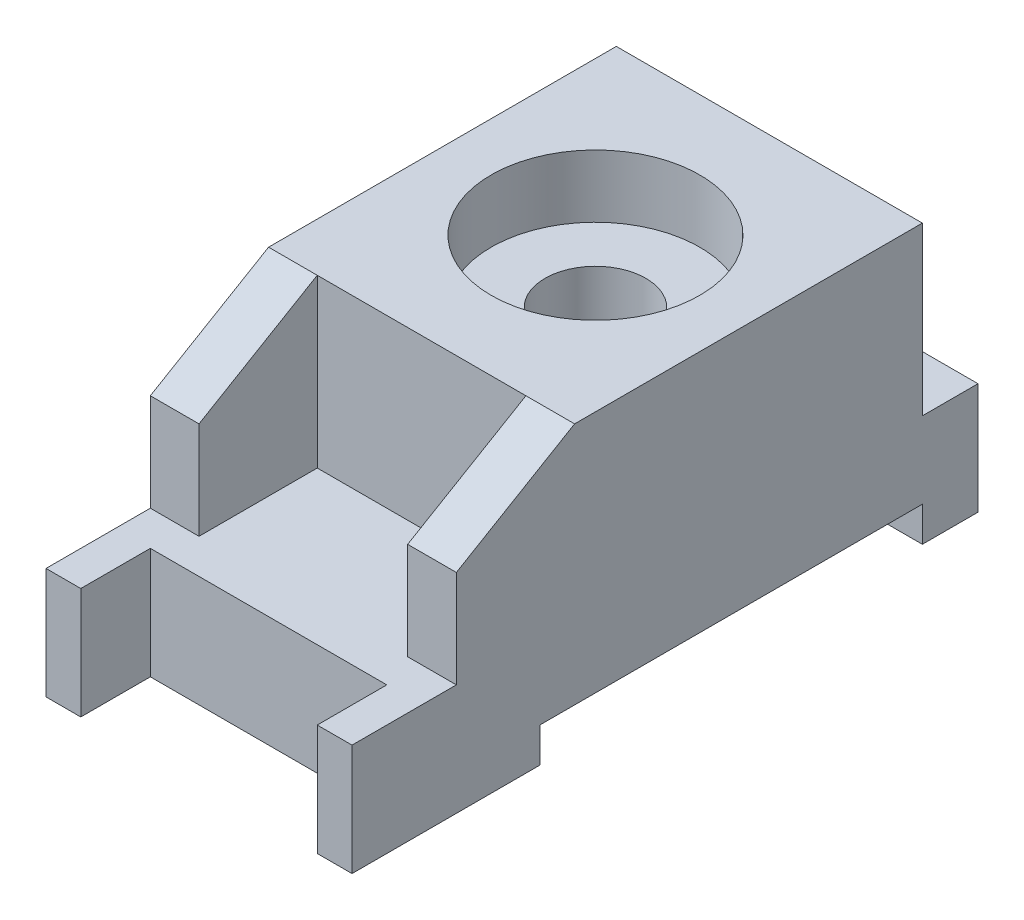
ISO-10303-21;
HEADER;
FILE_DESCRIPTION(('STEP AP214'),'2;1');
FILE_NAME('part.step','',(''),(''),'','','');
FILE_SCHEMA(('AUTOMOTIVE_DESIGN { 1 0 10303 214 1 1 1 1 }'));
ENDSEC;
DATA;
#1=APPLICATION_CONTEXT('core data for automotive mechanical design processes');
#2=APPLICATION_PROTOCOL_DEFINITION('international standard','automotive_design',2000,#1);
#3=PRODUCT_CONTEXT('',#1,'mechanical');
#4=PRODUCT('Part','Part','',(#3));
#5=PRODUCT_RELATED_PRODUCT_CATEGORY('part','',(#4));
#6=PRODUCT_DEFINITION_FORMATION('','',#4);
#7=PRODUCT_DEFINITION_CONTEXT('part definition',#1,'design');
#8=PRODUCT_DEFINITION('design','',#6,#7);
#9=PRODUCT_DEFINITION_SHAPE('','',#8);
#10=(LENGTH_UNIT() NAMED_UNIT(*) SI_UNIT(.MILLI.,.METRE.));
#11=(NAMED_UNIT(*) PLANE_ANGLE_UNIT() SI_UNIT($,.RADIAN.));
#12=(NAMED_UNIT(*) SI_UNIT($,.STERADIAN.) SOLID_ANGLE_UNIT());
#13=UNCERTAINTY_MEASURE_WITH_UNIT(LENGTH_MEASURE(1.E-05),#10,'distance_accuracy_value','');
#14=(GEOMETRIC_REPRESENTATION_CONTEXT(3) GLOBAL_UNCERTAINTY_ASSIGNED_CONTEXT((#13)) GLOBAL_UNIT_ASSIGNED_CONTEXT((#10,
#11,#12)) REPRESENTATION_CONTEXT('',''));
#15=CARTESIAN_POINT('',(0.,0.,0.));
#16=DIRECTION('',(0.,0.,1.));
#17=DIRECTION('',(1.,0.,0.));
#18=AXIS2_PLACEMENT_3D('',#15,#16,#17);
#19=CARTESIAN_POINT('',(-22.,32.,75.));
#20=DIRECTION('',(0.,0.,-1.));
#21=DIRECTION('',(-1.,0.,0.));
#22=AXIS2_PLACEMENT_3D('',#19,#20,#21);
#23=PLANE('',#22);
#24=DIRECTION('',(0.,1.,0.));
#25=VECTOR('',#24,1.);
#26=CARTESIAN_POINT('',(-15.,8.,75.));
#27=LINE('',#26,#25);
#28=CARTESIAN_POINT('',(-15.,8.,75.));
#29=VERTEX_POINT('',#28);
#30=CARTESIAN_POINT('',(-15.,22.,75.));
#31=VERTEX_POINT('',#30);
#32=EDGE_CURVE('E241',#29,#31,#27,.T.);
#33=ORIENTED_EDGE('',*,*,#32,.T.);
#34=DIRECTION('',(1.,0.,0.));
#35=VECTOR('',#34,1.);
#36=CARTESIAN_POINT('',(-22.,22.,75.));
#37=LINE('',#36,#35);
#38=CARTESIAN_POINT('',(-22.,22.,75.));
#39=VERTEX_POINT('',#38);
#40=EDGE_CURVE('E65',#39,#31,#37,.T.);
#41=ORIENTED_EDGE('',*,*,#40,.F.);
#42=DIRECTION('',(0.,-1.,0.));
#43=VECTOR('',#42,1.);
#44=CARTESIAN_POINT('',(-22.,32.,75.));
#45=LINE('',#44,#43);
#46=CARTESIAN_POINT('',(-22.,8.,75.));
#47=VERTEX_POINT('',#46);
#48=EDGE_CURVE('E239',#39,#47,#45,.T.);
#49=ORIENTED_EDGE('',*,*,#48,.T.);
#50=DIRECTION('',(1.,0.,0.));
#51=VECTOR('',#50,1.);
#52=CARTESIAN_POINT('',(-22.,8.,75.));
#53=LINE('',#52,#51);
#54=EDGE_CURVE('E295',#47,#29,#53,.T.);
#55=ORIENTED_EDGE('',*,*,#54,.T.);
#56=EDGE_LOOP('',(#33,#41,#49,#55));
#57=FACE_BOUND('',#56,.T.);
#58=ADVANCED_FACE('F48',(#57),#23,.F.);
#59=CARTESIAN_POINT('',(-22.,8.,90.));
#60=DIRECTION('',(0.,-1.,0.));
#61=DIRECTION('',(0.,0.,-1.));
#62=AXIS2_PLACEMENT_3D('',#59,#60,#61);
#63=PLANE('',#62);
#64=DIRECTION('',(-1.,0.,0.));
#65=VECTOR('',#64,1.);
#66=CARTESIAN_POINT('',(22.,8.,8.));
#67=LINE('',#66,#65);
#68=CARTESIAN_POINT('',(22.,8.,8.00000000000004));
#69=VERTEX_POINT('',#68);
#70=CARTESIAN_POINT('',(-22.,8.,8.00000000000004));
#71=VERTEX_POINT('',#70);
#72=EDGE_CURVE('E345',#69,#71,#67,.T.);
#73=ORIENTED_EDGE('',*,*,#72,.F.);
#74=DIRECTION('',(0.,0.,-1.));
#75=VECTOR('',#74,1.);
#76=CARTESIAN_POINT('',(22.,8.,90.));
#77=LINE('',#76,#75);
#78=CARTESIAN_POINT('',(22.,8.,0.));
#79=VERTEX_POINT('',#78);
#80=EDGE_CURVE('E364',#69,#79,#77,.T.);
#81=ORIENTED_EDGE('',*,*,#80,.T.);
#82=DIRECTION('',(-1.,0.,0.));
#83=VECTOR('',#82,1.);
#84=CARTESIAN_POINT('',(-22.,8.,0.));
#85=LINE('',#84,#83);
#86=CARTESIAN_POINT('',(-22.,8.,0.));
#87=VERTEX_POINT('',#86);
#88=EDGE_CURVE('E393',#79,#87,#85,.T.);
#89=ORIENTED_EDGE('',*,*,#88,.T.);
#90=DIRECTION('',(0.,0.,-1.));
#91=VECTOR('',#90,1.);
#92=CARTESIAN_POINT('',(-22.,8.,90.));
#93=LINE('',#92,#91);
#94=EDGE_CURVE('E76',#71,#87,#93,.T.);
#95=ORIENTED_EDGE('',*,*,#94,.F.);
#96=EDGE_LOOP('',(#73,#81,#89,#95));
#97=FACE_BOUND('',#96,.T.);
#98=ADVANCED_FACE('F495',(#97),#63,.F.);
#99=ORIENTED_EDGE('',*,*,#54,.F.);
#100=CARTESIAN_POINT('',(-22.,8.,90.));
#101=VERTEX_POINT('',#100);
#102=EDGE_CURVE('E249',#101,#47,#93,.T.);
#103=ORIENTED_EDGE('',*,*,#102,.F.);
#104=DIRECTION('',(-1.,0.,0.));
#105=VECTOR('',#104,1.);
#106=CARTESIAN_POINT('',(-22.,8.,90.));
#107=LINE('',#106,#105);
#108=CARTESIAN_POINT('',(-17.,8.,90.));
#109=VERTEX_POINT('',#108);
#110=EDGE_CURVE('E466',#109,#101,#107,.T.);
#111=ORIENTED_EDGE('',*,*,#110,.F.);
#112=DIRECTION('',(0.,0.,1.));
#113=VECTOR('',#112,1.);
#114=CARTESIAN_POINT('',(-17.,8.,90.));
#115=LINE('',#114,#113);
#116=CARTESIAN_POINT('',(-17.,8.,80.));
#117=VERTEX_POINT('',#116);
#118=EDGE_CURVE('E268',#117,#109,#115,.T.);
#119=ORIENTED_EDGE('',*,*,#118,.F.);
#120=DIRECTION('',(-1.,0.,0.));
#121=VECTOR('',#120,1.);
#122=CARTESIAN_POINT('',(-17.,8.,80.));
#123=LINE('',#122,#121);
#124=CARTESIAN_POINT('',(17.,8.,80.));
#125=VERTEX_POINT('',#124);
#126=EDGE_CURVE('E257',#125,#117,#123,.T.);
#127=ORIENTED_EDGE('',*,*,#126,.F.);
#128=DIRECTION('',(0.,0.,-1.));
#129=VECTOR('',#128,1.);
#130=CARTESIAN_POINT('',(17.,8.,80.));
#131=LINE('',#130,#129);
#132=CARTESIAN_POINT('',(17.,8.,90.));
#133=VERTEX_POINT('',#132);
#134=EDGE_CURVE('E251',#133,#125,#131,.T.);
#135=ORIENTED_EDGE('',*,*,#134,.F.);
#136=CARTESIAN_POINT('',(22.,8.,90.));
#137=VERTEX_POINT('',#136);
#138=EDGE_CURVE('E408',#137,#133,#107,.T.);
#139=ORIENTED_EDGE('',*,*,#138,.F.);
#140=CARTESIAN_POINT('',(22.,8.,75.));
#141=VERTEX_POINT('',#140);
#142=EDGE_CURVE('E58',#137,#141,#77,.T.);
#143=ORIENTED_EDGE('',*,*,#142,.T.);
#144=CARTESIAN_POINT('',(15.,8.,75.));
#145=VERTEX_POINT('',#144);
#146=EDGE_CURVE('E318',#145,#141,#53,.T.);
#147=ORIENTED_EDGE('',*,*,#146,.F.);
#148=DIRECTION('',(0.,0.,-1.));
#149=VECTOR('',#148,1.);
#150=CARTESIAN_POINT('',(15.,8.,58.));
#151=LINE('',#150,#149);
#152=CARTESIAN_POINT('',(15.,8.,58.));
#153=VERTEX_POINT('',#152);
#154=EDGE_CURVE('E314',#145,#153,#151,.T.);
#155=ORIENTED_EDGE('',*,*,#154,.T.);
#156=DIRECTION('',(-1.,0.,0.));
#157=VECTOR('',#156,1.);
#158=CARTESIAN_POINT('',(-15.,8.,58.));
#159=LINE('',#158,#157);
#160=CARTESIAN_POINT('',(-15.,8.,58.));
#161=VERTEX_POINT('',#160);
#162=EDGE_CURVE('E307',#153,#161,#159,.T.);
#163=ORIENTED_EDGE('',*,*,#162,.T.);
#164=DIRECTION('',(0.,0.,1.));
#165=VECTOR('',#164,1.);
#166=CARTESIAN_POINT('',(-15.,8.,75.));
#167=LINE('',#166,#165);
#168=EDGE_CURVE('E301',#161,#29,#167,.T.);
#169=ORIENTED_EDGE('',*,*,#168,.T.);
#170=EDGE_LOOP('',(#99,#103,#111,#119,#127,#135,#139,#143,#147,#155,#163,#169));
#171=FACE_BOUND('',#170,.T.);
#172=ADVANCED_FACE('F340',(#171),#63,.F.);
#173=CARTESIAN_POINT('',(0.,0.,90.));
#174=DIRECTION('',(0.,0.,-1.));
#175=DIRECTION('',(-1.,0.,0.));
#176=AXIS2_PLACEMENT_3D('',#173,#174,#175);
#177=PLANE('',#176);
#178=DIRECTION('',(1.,0.,0.));
#179=VECTOR('',#178,1.);
#180=CARTESIAN_POINT('',(-22.,-8.,90.));
#181=LINE('',#180,#179);
#182=CARTESIAN_POINT('',(-22.,-8.,90.));
#183=VERTEX_POINT('',#182);
#184=CARTESIAN_POINT('',(-17.,-8.00000000000001,90.));
#185=VERTEX_POINT('',#184);
#186=EDGE_CURVE('E399',#183,#185,#181,.T.);
#187=ORIENTED_EDGE('',*,*,#186,.T.);
#188=DIRECTION('',(0.,1.,0.));
#189=VECTOR('',#188,1.);
#190=CARTESIAN_POINT('',(-17.,-8.00000000000001,90.));
#191=LINE('',#190,#189);
#192=EDGE_CURVE('E413',#185,#109,#191,.T.);
#193=ORIENTED_EDGE('',*,*,#192,.T.);
#194=ORIENTED_EDGE('',*,*,#110,.T.);
#195=DIRECTION('',(0.,-1.,0.));
#196=VECTOR('',#195,1.);
#197=CARTESIAN_POINT('',(-22.,-8.,90.));
#198=LINE('',#197,#196);
#199=EDGE_CURVE('E404',#101,#183,#198,.T.);
#200=ORIENTED_EDGE('',*,*,#199,.T.);
#201=EDGE_LOOP('',(#187,#193,#194,#200));
#202=FACE_BOUND('',#201,.T.);
#203=ADVANCED_FACE('F516',(#202),#177,.F.);
#204=CARTESIAN_POINT('',(-22.,-8.,90.));
#205=DIRECTION('',(0.,1.,0.));
#206=DIRECTION('',(0.,0.,1.));
#207=AXIS2_PLACEMENT_3D('',#204,#205,#206);
#208=PLANE('',#207);
#209=DIRECTION('',(0.,0.,-1.));
#210=VECTOR('',#209,1.);
#211=CARTESIAN_POINT('',(22.,-8.,90.));
#212=LINE('',#211,#210);
#213=CARTESIAN_POINT('',(22.,-8.,8.));
#214=VERTEX_POINT('',#213);
#215=CARTESIAN_POINT('',(22.,-8.,0.));
#216=VERTEX_POINT('',#215);
#217=EDGE_CURVE('E383',#214,#216,#212,.T.);
#218=ORIENTED_EDGE('',*,*,#217,.F.);
#219=DIRECTION('',(1.,0.,0.));
#220=VECTOR('',#219,1.);
#221=CARTESIAN_POINT('',(-22.,-8.,8.));
#222=LINE('',#221,#220);
#223=CARTESIAN_POINT('',(-22.,-8.,8.));
#224=VERTEX_POINT('',#223);
#225=EDGE_CURVE('E398',#224,#214,#222,.T.);
#226=ORIENTED_EDGE('',*,*,#225,.F.);
#227=DIRECTION('',(0.,0.,-1.));
#228=VECTOR('',#227,1.);
#229=CARTESIAN_POINT('',(-22.,-8.,90.));
#230=LINE('',#229,#228);
#231=CARTESIAN_POINT('',(-22.,-8.,0.));
#232=VERTEX_POINT('',#231);
#233=EDGE_CURVE('E378',#224,#232,#230,.T.);
#234=ORIENTED_EDGE('',*,*,#233,.T.);
#235=DIRECTION('',(1.,0.,0.));
#236=VECTOR('',#235,1.);
#237=CARTESIAN_POINT('',(-22.,-8.,0.));
#238=LINE('',#237,#236);
#239=EDGE_CURVE('E384',#232,#216,#238,.T.);
#240=ORIENTED_EDGE('',*,*,#239,.T.);
#241=EDGE_LOOP('',(#218,#226,#234,#240));
#242=FACE_BOUND('',#241,.T.);
#243=ADVANCED_FACE('F500',(#242),#208,.F.);
#244=CARTESIAN_POINT('',(22.,-8.,90.));
#245=DIRECTION('',(-1.,0.,0.));
#246=DIRECTION('',(0.,0.,1.));
#247=AXIS2_PLACEMENT_3D('',#244,#245,#246);
#248=PLANE('',#247);
#249=DIRECTION('',(0.,0.,-1.));
#250=VECTOR('',#249,1.);
#251=CARTESIAN_POINT('',(22.,32.,75.));
#252=LINE('',#251,#250);
#253=CARTESIAN_POINT('',(22.,32.,58.));
#254=VERTEX_POINT('',#253);
#255=CARTESIAN_POINT('',(22.,32.,8.));
#256=VERTEX_POINT('',#255);
#257=EDGE_CURVE('E282',#254,#256,#252,.T.);
#258=ORIENTED_EDGE('',*,*,#257,.F.);
#259=DIRECTION('',(0.,0.507020126563394,-0.861934215157769));
#260=VECTOR('',#259,1.);
#261=CARTESIAN_POINT('',(22.,22.,75.));
#262=LINE('',#261,#260);
#263=CARTESIAN_POINT('',(22.,22.,75.));
#264=VERTEX_POINT('',#263);
#265=EDGE_CURVE('E234',#264,#254,#262,.T.);
#266=ORIENTED_EDGE('',*,*,#265,.F.);
#267=DIRECTION('',(0.,-1.,0.));
#268=VECTOR('',#267,1.);
#269=CARTESIAN_POINT('',(22.,32.,75.));
#270=LINE('',#269,#268);
#271=EDGE_CURVE('E252',#264,#141,#270,.T.);
#272=ORIENTED_EDGE('',*,*,#271,.T.);
#273=ORIENTED_EDGE('',*,*,#142,.F.);
#274=DIRECTION('',(0.,1.,0.));
#275=VECTOR('',#274,1.);
#276=CARTESIAN_POINT('',(22.,-8.,90.));
#277=LINE('',#276,#275);
#278=CARTESIAN_POINT('',(22.,-8.,90.));
#279=VERTEX_POINT('',#278);
#280=EDGE_CURVE('E388',#279,#137,#277,.T.);
#281=ORIENTED_EDGE('',*,*,#280,.F.);
#282=CARTESIAN_POINT('',(22.,-8.,63.));
#283=VERTEX_POINT('',#282);
#284=EDGE_CURVE('E379',#279,#283,#212,.T.);
#285=ORIENTED_EDGE('',*,*,#284,.T.);
#286=DIRECTION('',(0.,-1.,0.));
#287=VECTOR('',#286,1.);
#288=CARTESIAN_POINT('',(22.,-8.00000000000001,63.));
#289=LINE('',#288,#287);
#290=CARTESIAN_POINT('',(22.,-3.00000000000001,63.));
#291=VERTEX_POINT('',#290);
#292=EDGE_CURVE('E435',#291,#283,#289,.T.);
#293=ORIENTED_EDGE('',*,*,#292,.F.);
#294=DIRECTION('',(0.,0.,1.));
#295=VECTOR('',#294,1.);
#296=CARTESIAN_POINT('',(22.,-3.00000000000001,63.));
#297=LINE('',#296,#295);
#298=CARTESIAN_POINT('',(22.,-3.00000000000001,8.));
#299=VERTEX_POINT('',#298);
#300=EDGE_CURVE('E447',#299,#291,#297,.T.);
#301=ORIENTED_EDGE('',*,*,#300,.F.);
#302=DIRECTION('',(0.,1.,0.));
#303=VECTOR('',#302,1.);
#304=CARTESIAN_POINT('',(22.,-3.00000000000001,8.));
#305=LINE('',#304,#303);
#306=EDGE_CURVE('E419',#214,#299,#305,.T.);
#307=ORIENTED_EDGE('',*,*,#306,.F.);
#308=ORIENTED_EDGE('',*,*,#217,.T.);
#309=DIRECTION('',(0.,1.,0.));
#310=VECTOR('',#309,1.);
#311=CARTESIAN_POINT('',(22.,-8.,0.));
#312=LINE('',#311,#310);
#313=EDGE_CURVE('E366',#216,#79,#312,.T.);
#314=ORIENTED_EDGE('',*,*,#313,.T.);
#315=ORIENTED_EDGE('',*,*,#80,.F.);
#316=DIRECTION('',(0.,-1.,0.));
#317=VECTOR('',#316,1.);
#318=CARTESIAN_POINT('',(22.,32.,8.));
#319=LINE('',#318,#317);
#320=EDGE_CURVE('E259',#256,#69,#319,.T.);
#321=ORIENTED_EDGE('',*,*,#320,.F.);
#322=EDGE_LOOP('',(#258,#266,#272,#273,#281,#285,#293,#301,#307,#308,#314,#315,#321));
#323=FACE_BOUND('',#322,.T.);
#324=ADVANCED_FACE('F50',(#323),#248,.F.);
#325=CARTESIAN_POINT('',(-22.,-8.,90.));
#326=DIRECTION('',(1.,0.,0.));
#327=DIRECTION('',(0.,0.,-1.));
#328=AXIS2_PLACEMENT_3D('',#325,#326,#327);
#329=PLANE('',#328);
#330=ORIENTED_EDGE('',*,*,#48,.F.);
#331=DIRECTION('',(0.,0.507020126563394,-0.861934215157769));
#332=VECTOR('',#331,1.);
#333=CARTESIAN_POINT('',(-22.,22.,75.));
#334=LINE('',#333,#332);
#335=CARTESIAN_POINT('',(-22.,32.,58.));
#336=VERTEX_POINT('',#335);
#337=EDGE_CURVE('E224',#39,#336,#334,.T.);
#338=ORIENTED_EDGE('',*,*,#337,.T.);
#339=DIRECTION('',(0.,0.,1.));
#340=VECTOR('',#339,1.);
#341=CARTESIAN_POINT('',(-22.,32.,8.00000000000001));
#342=LINE('',#341,#340);
#343=CARTESIAN_POINT('',(-22.,32.,8.00000000000001));
#344=VERTEX_POINT('',#343);
#345=EDGE_CURVE('E288',#344,#336,#342,.T.);
#346=ORIENTED_EDGE('',*,*,#345,.F.);
#347=DIRECTION('',(0.,-1.,0.));
#348=VECTOR('',#347,1.);
#349=CARTESIAN_POINT('',(-22.,32.,8.00000000000001));
#350=LINE('',#349,#348);
#351=EDGE_CURVE('E294',#344,#71,#350,.T.);
#352=ORIENTED_EDGE('',*,*,#351,.T.);
#353=ORIENTED_EDGE('',*,*,#94,.T.);
#354=DIRECTION('',(0.,-1.,0.));
#355=VECTOR('',#354,1.);
#356=CARTESIAN_POINT('',(-22.,-8.,0.));
#357=LINE('',#356,#355);
#358=EDGE_CURVE('E389',#87,#232,#357,.T.);
#359=ORIENTED_EDGE('',*,*,#358,.T.);
#360=ORIENTED_EDGE('',*,*,#233,.F.);
#361=DIRECTION('',(0.,1.,0.));
#362=VECTOR('',#361,1.);
#363=CARTESIAN_POINT('',(-22.,-3.00000000000001,8.));
#364=LINE('',#363,#362);
#365=CARTESIAN_POINT('',(-22.,-3.00000000000001,8.));
#366=VERTEX_POINT('',#365);
#367=EDGE_CURVE('E430',#224,#366,#364,.T.);
#368=ORIENTED_EDGE('',*,*,#367,.T.);
#369=DIRECTION('',(0.,0.,1.));
#370=VECTOR('',#369,1.);
#371=CARTESIAN_POINT('',(-22.,-3.00000000000001,63.));
#372=LINE('',#371,#370);
#373=CARTESIAN_POINT('',(-22.,-3.00000000000001,63.));
#374=VERTEX_POINT('',#373);
#375=EDGE_CURVE('E434',#366,#374,#372,.T.);
#376=ORIENTED_EDGE('',*,*,#375,.T.);
#377=DIRECTION('',(0.,-1.,0.));
#378=VECTOR('',#377,1.);
#379=CARTESIAN_POINT('',(-22.,-8.00000000000001,63.));
#380=LINE('',#379,#378);
#381=CARTESIAN_POINT('',(-22.,-8.00000000000001,63.));
#382=VERTEX_POINT('',#381);
#383=EDGE_CURVE('E439',#374,#382,#380,.T.);
#384=ORIENTED_EDGE('',*,*,#383,.T.);
#385=EDGE_CURVE('E374',#183,#382,#230,.T.);
#386=ORIENTED_EDGE('',*,*,#385,.F.);
#387=ORIENTED_EDGE('',*,*,#199,.F.);
#388=ORIENTED_EDGE('',*,*,#102,.T.);
#389=EDGE_LOOP('',(#330,#338,#346,#352,#353,#359,#360,#368,#376,#384,#386,#387,#388));
#390=FACE_BOUND('',#389,.T.);
#391=ADVANCED_FACE('F246',(#390),#329,.F.);
#392=DIRECTION('',(-1.,0.,0.));
#393=VECTOR('',#392,1.);
#394=CARTESIAN_POINT('',(-17.,-8.00000000000001,80.));
#395=LINE('',#394,#393);
#396=CARTESIAN_POINT('',(17.,-8.00000000000001,80.));
#397=VERTEX_POINT('',#396);
#398=CARTESIAN_POINT('',(-17.,-8.00000000000001,80.));
#399=VERTEX_POINT('',#398);
#400=EDGE_CURVE('E267',#397,#399,#395,.T.);
#401=ORIENTED_EDGE('',*,*,#400,.T.);
#402=DIRECTION('',(0.,0.,1.));
#403=VECTOR('',#402,1.);
#404=CARTESIAN_POINT('',(-17.,-8.00000000000001,90.));
#405=LINE('',#404,#403);
#406=EDGE_CURVE('E273',#399,#185,#405,.T.);
#407=ORIENTED_EDGE('',*,*,#406,.T.);
#408=ORIENTED_EDGE('',*,*,#186,.F.);
#409=ORIENTED_EDGE('',*,*,#385,.T.);
#410=DIRECTION('',(1.,0.,0.));
#411=VECTOR('',#410,1.);
#412=CARTESIAN_POINT('',(-22.,-8.00000000000001,63.));
#413=LINE('',#412,#411);
#414=EDGE_CURVE('E455',#382,#283,#413,.T.);
#415=ORIENTED_EDGE('',*,*,#414,.T.);
#416=ORIENTED_EDGE('',*,*,#284,.F.);
#417=CARTESIAN_POINT('',(17.,-8.,90.));
#418=VERTEX_POINT('',#417);
#419=EDGE_CURVE('E403',#418,#279,#181,.T.);
#420=ORIENTED_EDGE('',*,*,#419,.F.);
#421=DIRECTION('',(0.,0.,-1.));
#422=VECTOR('',#421,1.);
#423=CARTESIAN_POINT('',(17.,-8.00000000000001,80.));
#424=LINE('',#423,#422);
#425=EDGE_CURVE('E263',#418,#397,#424,.T.);
#426=ORIENTED_EDGE('',*,*,#425,.T.);
#427=EDGE_LOOP('',(#401,#407,#408,#409,#415,#416,#420,#426));
#428=FACE_BOUND('',#427,.T.);
#429=ADVANCED_FACE('F485',(#428),#208,.F.);
#430=ORIENTED_EDGE('',*,*,#138,.T.);
#431=DIRECTION('',(0.,1.,0.));
#432=VECTOR('',#431,1.);
#433=CARTESIAN_POINT('',(17.,-8.00000000000001,90.));
#434=LINE('',#433,#432);
#435=EDGE_CURVE('E426',#418,#133,#434,.T.);
#436=ORIENTED_EDGE('',*,*,#435,.F.);
#437=ORIENTED_EDGE('',*,*,#419,.T.);
#438=ORIENTED_EDGE('',*,*,#280,.T.);
#439=EDGE_LOOP('',(#430,#436,#437,#438));
#440=FACE_BOUND('',#439,.T.);
#441=ADVANCED_FACE('F475',(#440),#177,.F.);
#442=CARTESIAN_POINT('',(0.,0.,0.));
#443=DIRECTION('',(0.,0.,-1.));
#444=DIRECTION('',(-1.,0.,0.));
#445=AXIS2_PLACEMENT_3D('',#442,#443,#444);
#446=PLANE('',#445);
#447=ORIENTED_EDGE('',*,*,#313,.F.);
#448=ORIENTED_EDGE('',*,*,#239,.F.);
#449=ORIENTED_EDGE('',*,*,#358,.F.);
#450=ORIENTED_EDGE('',*,*,#88,.F.);
#451=EDGE_LOOP('',(#447,#448,#449,#450));
#452=FACE_BOUND('',#451,.T.);
#453=ADVANCED_FACE('F497',(#452),#446,.T.);
#454=CARTESIAN_POINT('',(-22.,-3.00000000000001,8.));
#455=DIRECTION('',(0.,0.,-1.));
#456=DIRECTION('',(-1.,0.,0.));
#457=AXIS2_PLACEMENT_3D('',#454,#455,#456);
#458=PLANE('',#457);
#459=ORIENTED_EDGE('',*,*,#306,.T.);
#460=DIRECTION('',(1.,0.,0.));
#461=VECTOR('',#460,1.);
#462=CARTESIAN_POINT('',(-22.,-3.00000000000001,8.));
#463=LINE('',#462,#461);
#464=EDGE_CURVE('E443',#366,#299,#463,.T.);
#465=ORIENTED_EDGE('',*,*,#464,.F.);
#466=ORIENTED_EDGE('',*,*,#367,.F.);
#467=ORIENTED_EDGE('',*,*,#225,.T.);
#468=EDGE_LOOP('',(#459,#465,#466,#467));
#469=FACE_BOUND('',#468,.T.);
#470=ADVANCED_FACE('F504',(#469),#458,.F.);
#471=CARTESIAN_POINT('',(-22.,-8.00000000000001,63.));
#472=DIRECTION('',(0.,0.,1.));
#473=DIRECTION('',(1.,0.,0.));
#474=AXIS2_PLACEMENT_3D('',#471,#472,#473);
#475=PLANE('',#474);
#476=ORIENTED_EDGE('',*,*,#292,.T.);
#477=ORIENTED_EDGE('',*,*,#414,.F.);
#478=ORIENTED_EDGE('',*,*,#383,.F.);
#479=DIRECTION('',(1.,0.,0.));
#480=VECTOR('',#479,1.);
#481=CARTESIAN_POINT('',(-22.,-3.00000000000001,63.));
#482=LINE('',#481,#480);
#483=EDGE_CURVE('E459',#374,#291,#482,.T.);
#484=ORIENTED_EDGE('',*,*,#483,.T.);
#485=EDGE_LOOP('',(#476,#477,#478,#484));
#486=FACE_BOUND('',#485,.T.);
#487=ADVANCED_FACE('F512',(#486),#475,.F.);
#488=CARTESIAN_POINT('',(-22.,-3.00000000000001,63.));
#489=DIRECTION('',(0.,1.,0.));
#490=DIRECTION('',(0.,0.,1.));
#491=AXIS2_PLACEMENT_3D('',#488,#489,#490);
#492=PLANE('',#491);
#493=CARTESIAN_POINT('',(0.,-3.00000000000001,33.));
#494=DIRECTION('',(0.,1.,0.));
#495=DIRECTION('',(0.,0.,1.));
#496=AXIS2_PLACEMENT_3D('',#493,#494,#495);
#497=CIRCLE('',#496,7.25);
#498=CARTESIAN_POINT('',(0.,-3.00000000000001,40.25));
#499=VERTEX_POINT('',#498);
#500=EDGE_CURVE('E52',#499,#499,#497,.T.);
#501=ORIENTED_EDGE('',*,*,#500,.T.);
#502=EDGE_LOOP('',(#501));
#503=FACE_BOUND('',#502,.T.);
#504=ORIENTED_EDGE('',*,*,#300,.T.);
#505=ORIENTED_EDGE('',*,*,#483,.F.);
#506=ORIENTED_EDGE('',*,*,#375,.F.);
#507=ORIENTED_EDGE('',*,*,#464,.T.);
#508=EDGE_LOOP('',(#504,#505,#506,#507));
#509=FACE_BOUND('',#508,.T.);
#510=ADVANCED_FACE('F508',(#503,#509),#492,.F.);
#511=CARTESIAN_POINT('',(-17.,-8.00000000000001,90.));
#512=DIRECTION('',(-1.,0.,0.));
#513=DIRECTION('',(0.,0.,1.));
#514=AXIS2_PLACEMENT_3D('',#511,#512,#513);
#515=PLANE('',#514);
#516=ORIENTED_EDGE('',*,*,#118,.T.);
#517=ORIENTED_EDGE('',*,*,#192,.F.);
#518=ORIENTED_EDGE('',*,*,#406,.F.);
#519=DIRECTION('',(0.,1.,0.));
#520=VECTOR('',#519,1.);
#521=CARTESIAN_POINT('',(-17.,-8.00000000000001,80.));
#522=LINE('',#521,#520);
#523=EDGE_CURVE('E420',#399,#117,#522,.T.);
#524=ORIENTED_EDGE('',*,*,#523,.T.);
#525=EDGE_LOOP('',(#516,#517,#518,#524));
#526=FACE_BOUND('',#525,.T.);
#527=ADVANCED_FACE('F577',(#526),#515,.F.);
#528=CARTESIAN_POINT('',(-17.,-8.00000000000001,80.));
#529=DIRECTION('',(0.,0.,-1.));
#530=DIRECTION('',(-1.,0.,0.));
#531=AXIS2_PLACEMENT_3D('',#528,#529,#530);
#532=PLANE('',#531);
#533=ORIENTED_EDGE('',*,*,#126,.T.);
#534=ORIENTED_EDGE('',*,*,#523,.F.);
#535=ORIENTED_EDGE('',*,*,#400,.F.);
#536=DIRECTION('',(0.,1.,0.));
#537=VECTOR('',#536,1.);
#538=CARTESIAN_POINT('',(17.,-8.00000000000001,80.));
#539=LINE('',#538,#537);
#540=EDGE_CURVE('E424',#397,#125,#539,.T.);
#541=ORIENTED_EDGE('',*,*,#540,.T.);
#542=EDGE_LOOP('',(#533,#534,#535,#541));
#543=FACE_BOUND('',#542,.T.);
#544=ADVANCED_FACE('F572',(#543),#532,.F.);
#545=CARTESIAN_POINT('',(17.,-8.00000000000001,80.));
#546=DIRECTION('',(1.,0.,0.));
#547=DIRECTION('',(0.,0.,-1.));
#548=AXIS2_PLACEMENT_3D('',#545,#546,#547);
#549=PLANE('',#548);
#550=ORIENTED_EDGE('',*,*,#134,.T.);
#551=ORIENTED_EDGE('',*,*,#540,.F.);
#552=ORIENTED_EDGE('',*,*,#425,.F.);
#553=ORIENTED_EDGE('',*,*,#435,.T.);
#554=EDGE_LOOP('',(#550,#551,#552,#553));
#555=FACE_BOUND('',#554,.T.);
#556=ADVANCED_FACE('F482',(#555),#549,.F.);
#557=ORIENTED_EDGE('',*,*,#271,.F.);
#558=CARTESIAN_POINT('',(15.,22.,75.));
#559=VERTEX_POINT('',#558);
#560=EDGE_CURVE('E233',#559,#264,#37,.T.);
#561=ORIENTED_EDGE('',*,*,#560,.F.);
#562=DIRECTION('',(0.,1.,0.));
#563=VECTOR('',#562,1.);
#564=CARTESIAN_POINT('',(15.,8.,75.));
#565=LINE('',#564,#563);
#566=EDGE_CURVE('E306',#145,#559,#565,.T.);
#567=ORIENTED_EDGE('',*,*,#566,.F.);
#568=ORIENTED_EDGE('',*,*,#146,.T.);
#569=EDGE_LOOP('',(#557,#561,#567,#568));
#570=FACE_BOUND('',#569,.T.);
#571=ADVANCED_FACE('F337',(#570),#23,.F.);
#572=CARTESIAN_POINT('',(22.,32.,8.));
#573=DIRECTION('',(0.,0.,1.));
#574=DIRECTION('',(1.,0.,0.));
#575=AXIS2_PLACEMENT_3D('',#572,#573,#574);
#576=PLANE('',#575);
#577=ORIENTED_EDGE('',*,*,#72,.T.);
#578=ORIENTED_EDGE('',*,*,#351,.F.);
#579=DIRECTION('',(-1.,0.,0.));
#580=VECTOR('',#579,1.);
#581=CARTESIAN_POINT('',(22.,32.,8.));
#582=LINE('',#581,#580);
#583=EDGE_CURVE('E287',#256,#344,#582,.T.);
#584=ORIENTED_EDGE('',*,*,#583,.F.);
#585=ORIENTED_EDGE('',*,*,#320,.T.);
#586=EDGE_LOOP('',(#577,#578,#584,#585));
#587=FACE_BOUND('',#586,.T.);
#588=ADVANCED_FACE('F358',(#587),#576,.F.);
#589=CARTESIAN_POINT('',(0.,32.,0.));
#590=DIRECTION('',(0.,1.,0.));
#591=DIRECTION('',(0.,0.,1.));
#592=AXIS2_PLACEMENT_3D('',#589,#590,#591);
#593=PLANE('',#592);
#594=CARTESIAN_POINT('',(0.,32.,33.));
#595=DIRECTION('',(0.,1.,0.));
#596=DIRECTION('',(0.,0.,1.));
#597=AXIS2_PLACEMENT_3D('',#594,#595,#596);
#598=CIRCLE('',#597,15.);
#599=CARTESIAN_POINT('',(0.,32.,48.));
#600=VERTEX_POINT('',#599);
#601=EDGE_CURVE('E531',#600,#600,#598,.T.);
#602=ORIENTED_EDGE('',*,*,#601,.F.);
#603=EDGE_LOOP('',(#602));
#604=FACE_BOUND('',#603,.T.);
#605=DIRECTION('',(1.,0.,0.));
#606=VECTOR('',#605,1.);
#607=CARTESIAN_POINT('',(-22.,32.,58.));
#608=LINE('',#607,#606);
#609=CARTESIAN_POINT('',(15.,32.,58.));
#610=VERTEX_POINT('',#609);
#611=EDGE_CURVE('E243',#610,#254,#608,.T.);
#612=ORIENTED_EDGE('',*,*,#611,.T.);
#613=ORIENTED_EDGE('',*,*,#257,.T.);
#614=ORIENTED_EDGE('',*,*,#583,.T.);
#615=ORIENTED_EDGE('',*,*,#345,.T.);
#616=CARTESIAN_POINT('',(-15.,32.,58.));
#617=VERTEX_POINT('',#616);
#618=EDGE_CURVE('E227',#336,#617,#608,.T.);
#619=ORIENTED_EDGE('',*,*,#618,.T.);
#620=DIRECTION('',(-1.,0.,0.));
#621=VECTOR('',#620,1.);
#622=CARTESIAN_POINT('',(-15.,32.,58.));
#623=LINE('',#622,#621);
#624=EDGE_CURVE('E310',#610,#617,#623,.T.);
#625=ORIENTED_EDGE('',*,*,#624,.F.);
#626=EDGE_LOOP('',(#612,#613,#614,#615,#619,#625));
#627=FACE_BOUND('',#626,.T.);
#628=ADVANCED_FACE('F571',(#604,#627),#593,.T.);
#629=CARTESIAN_POINT('',(-15.,8.,75.));
#630=DIRECTION('',(-1.,0.,0.));
#631=DIRECTION('',(0.,0.,1.));
#632=AXIS2_PLACEMENT_3D('',#629,#630,#631);
#633=PLANE('',#632);
#634=DIRECTION('',(0.,1.,0.));
#635=VECTOR('',#634,1.);
#636=CARTESIAN_POINT('',(-15.,8.,58.));
#637=LINE('',#636,#635);
#638=EDGE_CURVE('E319',#161,#617,#637,.T.);
#639=ORIENTED_EDGE('',*,*,#638,.T.);
#640=DIRECTION('',(0.,-0.507020126563394,0.861934215157769));
#641=VECTOR('',#640,1.);
#642=CARTESIAN_POINT('',(-15.,18.401028277635,81.1182519280206));
#643=LINE('',#642,#641);
#644=EDGE_CURVE('E315',#617,#31,#643,.T.);
#645=ORIENTED_EDGE('',*,*,#644,.T.);
#646=ORIENTED_EDGE('',*,*,#32,.F.);
#647=ORIENTED_EDGE('',*,*,#168,.F.);
#648=EDGE_LOOP('',(#639,#645,#646,#647));
#649=FACE_BOUND('',#648,.T.);
#650=ADVANCED_FACE('F521',(#649),#633,.F.);
#651=CARTESIAN_POINT('',(-15.,8.,58.));
#652=DIRECTION('',(0.,0.,-1.));
#653=DIRECTION('',(-1.,0.,0.));
#654=AXIS2_PLACEMENT_3D('',#651,#652,#653);
#655=PLANE('',#654);
#656=ORIENTED_EDGE('',*,*,#624,.T.);
#657=ORIENTED_EDGE('',*,*,#638,.F.);
#658=ORIENTED_EDGE('',*,*,#162,.F.);
#659=DIRECTION('',(0.,1.,0.));
#660=VECTOR('',#659,1.);
#661=CARTESIAN_POINT('',(15.,8.,58.));
#662=LINE('',#661,#660);
#663=EDGE_CURVE('E323',#153,#610,#662,.T.);
#664=ORIENTED_EDGE('',*,*,#663,.T.);
#665=EDGE_LOOP('',(#656,#657,#658,#664));
#666=FACE_BOUND('',#665,.T.);
#667=ADVANCED_FACE('F641',(#666),#655,.F.);
#668=CARTESIAN_POINT('',(15.,8.,58.));
#669=DIRECTION('',(1.,0.,0.));
#670=DIRECTION('',(0.,0.,-1.));
#671=AXIS2_PLACEMENT_3D('',#668,#669,#670);
#672=PLANE('',#671);
#673=ORIENTED_EDGE('',*,*,#566,.T.);
#674=DIRECTION('',(0.,0.507020126563394,-0.861934215157769));
#675=VECTOR('',#674,1.);
#676=CARTESIAN_POINT('',(15.,25.8303341902314,68.4884318766067));
#677=LINE('',#676,#675);
#678=EDGE_CURVE('E12',#559,#610,#677,.T.);
#679=ORIENTED_EDGE('',*,*,#678,.T.);
#680=ORIENTED_EDGE('',*,*,#663,.F.);
#681=ORIENTED_EDGE('',*,*,#154,.F.);
#682=EDGE_LOOP('',(#673,#679,#680,#681));
#683=FACE_BOUND('',#682,.T.);
#684=ADVANCED_FACE('F330',(#683),#672,.F.);
#685=CARTESIAN_POINT('',(-22.,22.,75.));
#686=DIRECTION('',(0.,-0.861934215157769,-0.507020126563394));
#687=DIRECTION('',(0.,0.507020126563394,-0.861934215157769));
#688=AXIS2_PLACEMENT_3D('',#685,#686,#687);
#689=PLANE('',#688);
#690=ORIENTED_EDGE('',*,*,#560,.T.);
#691=ORIENTED_EDGE('',*,*,#265,.T.);
#692=ORIENTED_EDGE('',*,*,#611,.F.);
#693=ORIENTED_EDGE('',*,*,#678,.F.);
#694=EDGE_LOOP('',(#690,#691,#692,#693));
#695=FACE_BOUND('',#694,.T.);
#696=ADVANCED_FACE('F655',(#695),#689,.F.);
#697=ORIENTED_EDGE('',*,*,#618,.F.);
#698=ORIENTED_EDGE('',*,*,#337,.F.);
#699=ORIENTED_EDGE('',*,*,#40,.T.);
#700=ORIENTED_EDGE('',*,*,#644,.F.);
#701=EDGE_LOOP('',(#697,#698,#699,#700));
#702=FACE_BOUND('',#701,.T.);
#703=ADVANCED_FACE('F225',(#702),#689,.F.);
#704=CARTESIAN_POINT('',(0.,23.,33.));
#705=DIRECTION('',(0.,1.,0.));
#706=DIRECTION('',(0.,0.,1.));
#707=AXIS2_PLACEMENT_3D('',#704,#705,#706);
#708=CYLINDRICAL_SURFACE('',#707,15.);
#709=CARTESIAN_POINT('',(0.,23.,33.));
#710=DIRECTION('',(0.,1.,0.));
#711=DIRECTION('',(0.,0.,1.));
#712=AXIS2_PLACEMENT_3D('',#709,#710,#711);
#713=CIRCLE('',#712,15.);
#714=CARTESIAN_POINT('',(0.,23.,48.));
#715=VERTEX_POINT('',#714);
#716=EDGE_CURVE('E530',#715,#715,#713,.T.);
#717=ORIENTED_EDGE('',*,*,#716,.F.);
#718=EDGE_LOOP('',(#717));
#719=FACE_BOUND('',#718,.T.);
#720=ORIENTED_EDGE('',*,*,#601,.T.);
#721=EDGE_LOOP('',(#720));
#722=FACE_BOUND('',#721,.T.);
#723=ADVANCED_FACE('F556',(#719,#722),#708,.F.);
#724=CARTESIAN_POINT('',(0.,23.,33.));
#725=DIRECTION('',(0.,1.,0.));
#726=DIRECTION('',(0.,0.,1.));
#727=AXIS2_PLACEMENT_3D('',#724,#725,#726);
#728=PLANE('',#727);
#729=CARTESIAN_POINT('',(0.,23.,33.));
#730=DIRECTION('',(0.,1.,0.));
#731=DIRECTION('',(0.,0.,1.));
#732=AXIS2_PLACEMENT_3D('',#729,#730,#731);
#733=CIRCLE('',#732,7.25);
#734=CARTESIAN_POINT('',(0.,23.,40.25));
#735=VERTEX_POINT('',#734);
#736=EDGE_CURVE('E539',#735,#735,#733,.T.);
#737=ORIENTED_EDGE('',*,*,#736,.F.);
#738=EDGE_LOOP('',(#737));
#739=FACE_BOUND('',#738,.T.);
#740=ORIENTED_EDGE('',*,*,#716,.T.);
#741=EDGE_LOOP('',(#740));
#742=FACE_BOUND('',#741,.T.);
#743=ADVANCED_FACE('F551',(#739,#742),#728,.T.);
#744=CARTESIAN_POINT('',(0.,-8.00000000000001,33.));
#745=DIRECTION('',(0.,1.,0.));
#746=DIRECTION('',(0.,0.,1.));
#747=AXIS2_PLACEMENT_3D('',#744,#745,#746);
#748=CYLINDRICAL_SURFACE('',#747,7.25);
#749=ORIENTED_EDGE('',*,*,#736,.T.);
#750=EDGE_LOOP('',(#749));
#751=FACE_BOUND('',#750,.T.);
#752=ORIENTED_EDGE('',*,*,#500,.F.);
#753=EDGE_LOOP('',(#752));
#754=FACE_BOUND('',#753,.T.);
#755=ADVANCED_FACE('F549',(#751,#754),#748,.F.);
#756=CLOSED_SHELL('',(#58,#98,#172,#203,#243,#324,#391,#429,#441,#453,#470,#487,#510,#527,#544,
#556,#571,#588,#628,#650,#667,#684,#696,#703,#723,#743,#755));
#757=MANIFOLD_SOLID_BREP('B2',#756);
#758=ADVANCED_BREP_SHAPE_REPRESENTATION('',(#18,#757),#14);
#759=SHAPE_DEFINITION_REPRESENTATION(#9,#758);
ENDSEC;
END-ISO-10303-21;
